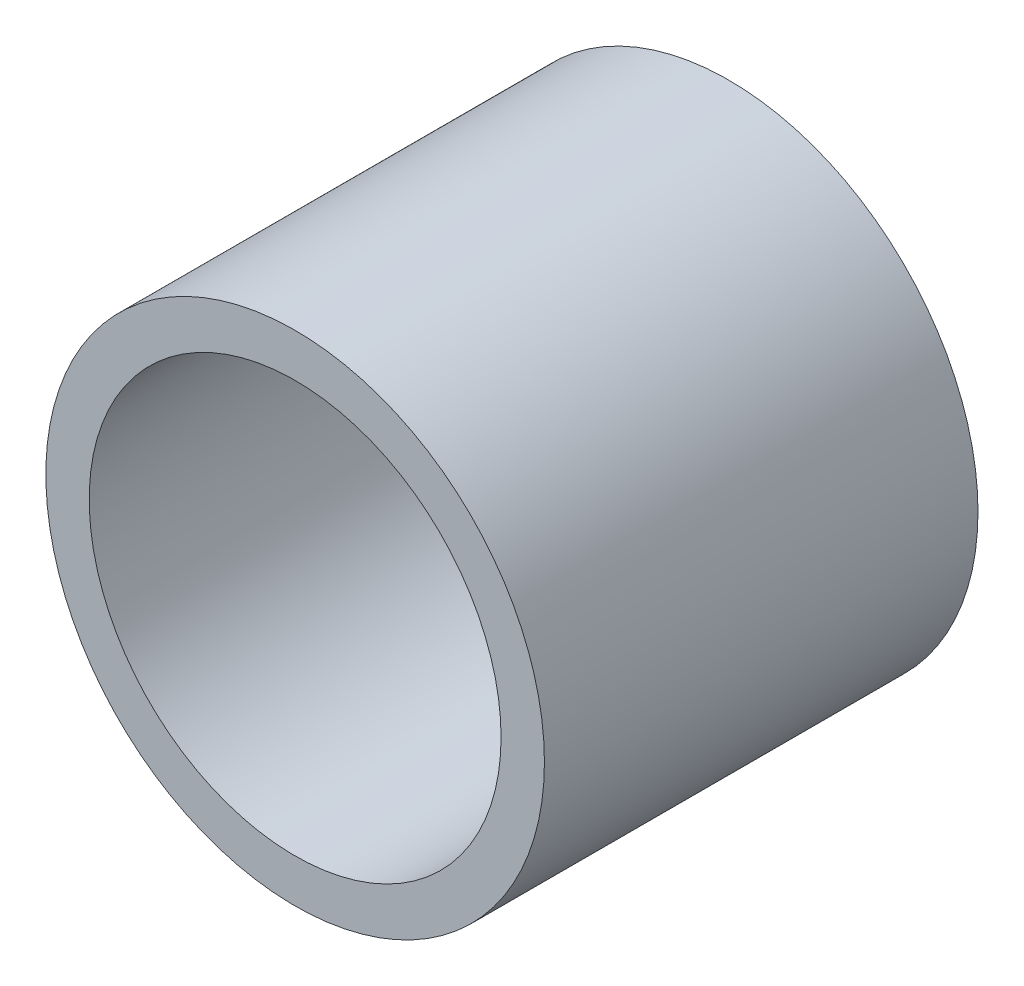
ISO-10303-21;
HEADER;
FILE_DESCRIPTION(('STEP AP214'),'2;1');
FILE_NAME('part.step','',(''),(''),'','','');
FILE_SCHEMA(('AUTOMOTIVE_DESIGN { 1 0 10303 214 1 1 1 1 }'));
ENDSEC;
DATA;
#1=APPLICATION_CONTEXT('core data for automotive mechanical design processes');
#2=APPLICATION_PROTOCOL_DEFINITION('international standard','automotive_design',2000,#1);
#3=PRODUCT_CONTEXT('',#1,'mechanical');
#4=PRODUCT('Part','Part','',(#3));
#5=PRODUCT_RELATED_PRODUCT_CATEGORY('part','',(#4));
#6=PRODUCT_DEFINITION_FORMATION('','',#4);
#7=PRODUCT_DEFINITION_CONTEXT('part definition',#1,'design');
#8=PRODUCT_DEFINITION('design','',#6,#7);
#9=PRODUCT_DEFINITION_SHAPE('','',#8);
#10=(LENGTH_UNIT() NAMED_UNIT(*) SI_UNIT(.MILLI.,.METRE.));
#11=(NAMED_UNIT(*) PLANE_ANGLE_UNIT() SI_UNIT($,.RADIAN.));
#12=(NAMED_UNIT(*) SI_UNIT($,.STERADIAN.) SOLID_ANGLE_UNIT());
#13=UNCERTAINTY_MEASURE_WITH_UNIT(LENGTH_MEASURE(1.E-05),#10,'distance_accuracy_value','');
#14=(GEOMETRIC_REPRESENTATION_CONTEXT(3) GLOBAL_UNCERTAINTY_ASSIGNED_CONTEXT((#13)) GLOBAL_UNIT_ASSIGNED_CONTEXT((#10,
#11,#12)) REPRESENTATION_CONTEXT('',''));
#15=CARTESIAN_POINT('',(0.,0.,0.));
#16=DIRECTION('',(0.,0.,1.));
#17=DIRECTION('',(1.,0.,0.));
#18=AXIS2_PLACEMENT_3D('',#15,#16,#17);
#19=CARTESIAN_POINT('',(0.,0.,10.));
#20=DIRECTION('',(0.,0.,1.));
#21=DIRECTION('',(1.,0.,0.));
#22=AXIS2_PLACEMENT_3D('',#19,#20,#21);
#23=PLANE('',#22);
#24=CARTESIAN_POINT('',(0.,0.,10.));
#25=DIRECTION('',(0.,0.,1.));
#26=DIRECTION('',(1.,0.,0.));
#27=AXIS2_PLACEMENT_3D('',#24,#25,#26);
#28=CIRCLE('',#27,5.75);
#29=CARTESIAN_POINT('',(5.75,0.,10.));
#30=VERTEX_POINT('',#29);
#31=EDGE_CURVE('E10',#30,#30,#28,.T.);
#32=ORIENTED_EDGE('',*,*,#31,.T.);
#33=EDGE_LOOP('',(#32));
#34=FACE_BOUND('',#33,.T.);
#35=CARTESIAN_POINT('',(0.,0.,10.));
#36=DIRECTION('',(0.,0.,1.));
#37=DIRECTION('',(1.,0.,0.));
#38=AXIS2_PLACEMENT_3D('',#35,#36,#37);
#39=CIRCLE('',#38,4.75);
#40=CARTESIAN_POINT('',(4.75,0.,10.));
#41=VERTEX_POINT('',#40);
#42=EDGE_CURVE('E56',#41,#41,#39,.T.);
#43=ORIENTED_EDGE('',*,*,#42,.F.);
#44=EDGE_LOOP('',(#43));
#45=FACE_BOUND('',#44,.T.);
#46=ADVANCED_FACE('F43',(#34,#45),#23,.T.);
#47=CARTESIAN_POINT('',(0.,0.,0.));
#48=DIRECTION('',(0.,0.,1.));
#49=DIRECTION('',(1.,0.,0.));
#50=AXIS2_PLACEMENT_3D('',#47,#48,#49);
#51=PLANE('',#50);
#52=CARTESIAN_POINT('',(0.,0.,0.));
#53=DIRECTION('',(0.,0.,1.));
#54=DIRECTION('',(1.,0.,0.));
#55=AXIS2_PLACEMENT_3D('',#52,#53,#54);
#56=CIRCLE('',#55,5.75);
#57=CARTESIAN_POINT('',(5.75,0.,0.));
#58=VERTEX_POINT('',#57);
#59=EDGE_CURVE('E47',#58,#58,#56,.T.);
#60=ORIENTED_EDGE('',*,*,#59,.F.);
#61=EDGE_LOOP('',(#60));
#62=FACE_BOUND('',#61,.T.);
#63=CARTESIAN_POINT('',(0.,0.,0.));
#64=DIRECTION('',(0.,0.,1.));
#65=DIRECTION('',(1.,0.,0.));
#66=AXIS2_PLACEMENT_3D('',#63,#64,#65);
#67=CIRCLE('',#66,4.75);
#68=CARTESIAN_POINT('',(4.75,0.,0.));
#69=VERTEX_POINT('',#68);
#70=EDGE_CURVE('E58',#69,#69,#67,.T.);
#71=ORIENTED_EDGE('',*,*,#70,.T.);
#72=EDGE_LOOP('',(#71));
#73=FACE_BOUND('',#72,.T.);
#74=ADVANCED_FACE('F70',(#62,#73),#51,.F.);
#75=CARTESIAN_POINT('',(0.,0.,10.));
#76=DIRECTION('',(0.,0.,-1.));
#77=DIRECTION('',(-1.,0.,0.));
#78=AXIS2_PLACEMENT_3D('',#75,#76,#77);
#79=CYLINDRICAL_SURFACE('',#78,5.75);
#80=ORIENTED_EDGE('',*,*,#31,.F.);
#81=EDGE_LOOP('',(#80));
#82=FACE_BOUND('',#81,.T.);
#83=ORIENTED_EDGE('',*,*,#59,.T.);
#84=EDGE_LOOP('',(#83));
#85=FACE_BOUND('',#84,.T.);
#86=ADVANCED_FACE('F45',(#82,#85),#79,.T.);
#87=CARTESIAN_POINT('',(0.,0.,10.));
#88=DIRECTION('',(0.,0.,-1.));
#89=DIRECTION('',(-1.,0.,0.));
#90=AXIS2_PLACEMENT_3D('',#87,#88,#89);
#91=CYLINDRICAL_SURFACE('',#90,4.75);
#92=ORIENTED_EDGE('',*,*,#42,.T.);
#93=EDGE_LOOP('',(#92));
#94=FACE_BOUND('',#93,.T.);
#95=ORIENTED_EDGE('',*,*,#70,.F.);
#96=EDGE_LOOP('',(#95));
#97=FACE_BOUND('',#96,.T.);
#98=ADVANCED_FACE('F66',(#94,#97),#91,.F.);
#99=CLOSED_SHELL('',(#46,#74,#86,#98));
#100=MANIFOLD_SOLID_BREP('B2',#99);
#101=ADVANCED_BREP_SHAPE_REPRESENTATION('',(#18,#100),#14);
#102=SHAPE_DEFINITION_REPRESENTATION(#9,#101);
ENDSEC;
END-ISO-10303-21;
